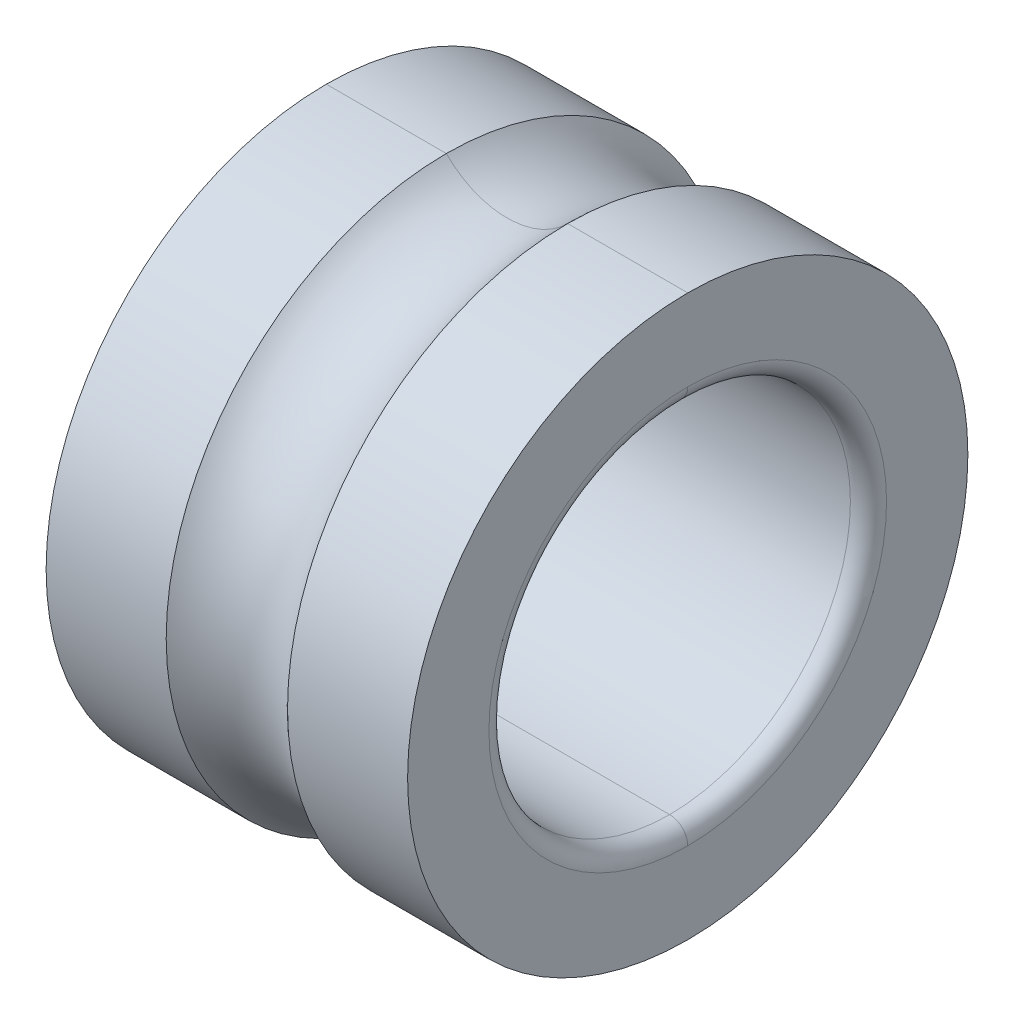
ISO-10303-21;
HEADER;
FILE_DESCRIPTION(('STEP AP214'),'2;1');
FILE_NAME('part.step','',(''),(''),'','','');
FILE_SCHEMA(('AUTOMOTIVE_DESIGN { 1 0 10303 214 1 1 1 1 }'));
ENDSEC;
DATA;
#1=APPLICATION_CONTEXT('core data for automotive mechanical design processes');
#2=APPLICATION_PROTOCOL_DEFINITION('international standard','automotive_design',2000,#1);
#3=PRODUCT_CONTEXT('',#1,'mechanical');
#4=PRODUCT('Part','Part','',(#3));
#5=PRODUCT_RELATED_PRODUCT_CATEGORY('part','',(#4));
#6=PRODUCT_DEFINITION_FORMATION('','',#4);
#7=PRODUCT_DEFINITION_CONTEXT('part definition',#1,'design');
#8=PRODUCT_DEFINITION('design','',#6,#7);
#9=PRODUCT_DEFINITION_SHAPE('','',#8);
#10=(LENGTH_UNIT() NAMED_UNIT(*) SI_UNIT(.MILLI.,.METRE.));
#11=(NAMED_UNIT(*) PLANE_ANGLE_UNIT() SI_UNIT($,.RADIAN.));
#12=(NAMED_UNIT(*) SI_UNIT($,.STERADIAN.) SOLID_ANGLE_UNIT());
#13=UNCERTAINTY_MEASURE_WITH_UNIT(LENGTH_MEASURE(1.E-05),#10,'distance_accuracy_value','');
#14=(GEOMETRIC_REPRESENTATION_CONTEXT(3) GLOBAL_UNCERTAINTY_ASSIGNED_CONTEXT((#13)) GLOBAL_UNIT_ASSIGNED_CONTEXT((#10,
#11,#12)) REPRESENTATION_CONTEXT('',''));
#15=CARTESIAN_POINT('',(0.,0.,0.));
#16=DIRECTION('',(0.,0.,1.));
#17=DIRECTION('',(1.,0.,0.));
#18=AXIS2_PLACEMENT_3D('',#15,#16,#17);
#19=CARTESIAN_POINT('',(-2.19329,0.,0.));
#20=DIRECTION('',(1.,0.,0.));
#21=DIRECTION('',(0.,-1.,0.));
#22=AXIS2_PLACEMENT_3D('',#19,#20,#21);
#23=CYLINDRICAL_SURFACE('',#22,1.9939);
#24=CARTESIAN_POINT('',(-1.79451,0.,0.));
#25=DIRECTION('',(-1.,0.,0.));
#26=DIRECTION('',(0.,1.,0.));
#27=AXIS2_PLACEMENT_3D('',#24,#25,#26);
#28=CIRCLE('',#27,1.9939);
#29=CARTESIAN_POINT('',(-1.79451,1.9939,0.));
#30=VERTEX_POINT('',#29);
#31=CARTESIAN_POINT('',(-1.79451,-1.9939,0.));
#32=VERTEX_POINT('',#31);
#33=EDGE_CURVE('E19',#30,#32,#28,.T.);
#34=ORIENTED_EDGE('',*,*,#33,.T.);
#35=DIRECTION('',(1.,0.,0.));
#36=VECTOR('',#35,1.);
#37=CARTESIAN_POINT('',(-1.79451,-1.9939,0.));
#38=LINE('',#37,#36);
#39=CARTESIAN_POINT('',(1.79451,-1.9939,0.));
#40=VERTEX_POINT('',#39);
#41=EDGE_CURVE('E10',#32,#40,#38,.T.);
#42=ORIENTED_EDGE('',*,*,#41,.T.);
#43=CARTESIAN_POINT('',(1.79451,0.,0.));
#44=DIRECTION('',(-1.,0.,0.));
#45=DIRECTION('',(0.,1.,0.));
#46=AXIS2_PLACEMENT_3D('',#43,#44,#45);
#47=CIRCLE('',#46,1.9939);
#48=CARTESIAN_POINT('',(1.79451,1.9939,0.));
#49=VERTEX_POINT('',#48);
#50=EDGE_CURVE('E84',#49,#40,#47,.T.);
#51=ORIENTED_EDGE('',*,*,#50,.F.);
#52=DIRECTION('',(1.,0.,0.));
#53=VECTOR('',#52,1.);
#54=CARTESIAN_POINT('',(-1.79451,1.9939,0.));
#55=LINE('',#54,#53);
#56=EDGE_CURVE('E24',#30,#49,#55,.T.);
#57=ORIENTED_EDGE('',*,*,#56,.F.);
#58=EDGE_LOOP('',(#34,#42,#51,#57));
#59=FACE_BOUND('',#58,.T.);
#60=ADVANCED_FACE('F16',(#59),#23,.F.);
#61=CARTESIAN_POINT('',(-2.19329,0.,0.));
#62=DIRECTION('',(1.,0.,0.));
#63=DIRECTION('',(0.,-1.,0.));
#64=AXIS2_PLACEMENT_3D('',#61,#62,#63);
#65=CYLINDRICAL_SURFACE('',#64,1.9939);
#66=CARTESIAN_POINT('',(1.79451,0.,0.));
#67=DIRECTION('',(1.,0.,0.));
#68=DIRECTION('',(0.,1.,0.));
#69=AXIS2_PLACEMENT_3D('',#66,#67,#68);
#70=CIRCLE('',#69,1.9939);
#71=EDGE_CURVE('E88',#49,#40,#70,.T.);
#72=ORIENTED_EDGE('',*,*,#71,.T.);
#73=ORIENTED_EDGE('',*,*,#41,.F.);
#74=CARTESIAN_POINT('',(-1.79451,0.,0.));
#75=DIRECTION('',(1.,0.,0.));
#76=DIRECTION('',(0.,1.,0.));
#77=AXIS2_PLACEMENT_3D('',#74,#75,#76);
#78=CIRCLE('',#77,1.9939);
#79=EDGE_CURVE('E91',#30,#32,#78,.T.);
#80=ORIENTED_EDGE('',*,*,#79,.F.);
#81=ORIENTED_EDGE('',*,*,#56,.T.);
#82=EDGE_LOOP('',(#72,#73,#80,#81));
#83=FACE_BOUND('',#82,.T.);
#84=ADVANCED_FACE('F93',(#83),#65,.F.);
#85=CARTESIAN_POINT('',(1.79451,0.,0.));
#86=DIRECTION('',(1.,0.,0.));
#87=DIRECTION('',(0.,-1.,0.));
#88=AXIS2_PLACEMENT_3D('',#85,#86,#87);
#89=TOROIDAL_SURFACE('',#88,2.19329,0.19939);
#90=CARTESIAN_POINT('',(1.9939,0.,0.));
#91=DIRECTION('',(1.,0.,0.));
#92=DIRECTION('',(0.,1.,0.));
#93=AXIS2_PLACEMENT_3D('',#90,#91,#92);
#94=CIRCLE('',#93,2.19329);
#95=CARTESIAN_POINT('',(1.9939,2.19329,0.));
#96=VERTEX_POINT('',#95);
#97=CARTESIAN_POINT('',(1.9939,-2.19329,0.));
#98=VERTEX_POINT('',#97);
#99=EDGE_CURVE('E147',#96,#98,#94,.T.);
#100=ORIENTED_EDGE('',*,*,#99,.T.);
#101=CARTESIAN_POINT('',(1.79451,-2.19329,0.));
#102=DIRECTION('',(0.,0.,-1.));
#103=DIRECTION('',(0.,1.,0.));
#104=AXIS2_PLACEMENT_3D('',#101,#102,#103);
#105=CIRCLE('',#104,0.19939);
#106=EDGE_CURVE('E151',#40,#98,#105,.T.);
#107=ORIENTED_EDGE('',*,*,#106,.F.);
#108=ORIENTED_EDGE('',*,*,#71,.F.);
#109=CARTESIAN_POINT('',(1.79451,2.19329,0.));
#110=DIRECTION('',(0.,0.,1.));
#111=DIRECTION('',(0.,-1.,0.));
#112=AXIS2_PLACEMENT_3D('',#109,#110,#111);
#113=CIRCLE('',#112,0.19939);
#114=EDGE_CURVE('E149',#49,#96,#113,.T.);
#115=ORIENTED_EDGE('',*,*,#114,.T.);
#116=EDGE_LOOP('',(#100,#107,#108,#115));
#117=FACE_BOUND('',#116,.T.);
#118=ADVANCED_FACE('F158',(#117),#89,.T.);
#119=CARTESIAN_POINT('',(1.79451,0.,0.));
#120=DIRECTION('',(1.,0.,0.));
#121=DIRECTION('',(0.,-1.,0.));
#122=AXIS2_PLACEMENT_3D('',#119,#120,#121);
#123=TOROIDAL_SURFACE('',#122,2.19329,0.19939);
#124=ORIENTED_EDGE('',*,*,#50,.T.);
#125=ORIENTED_EDGE('',*,*,#106,.T.);
#126=CARTESIAN_POINT('',(1.9939,0.,0.));
#127=DIRECTION('',(-1.,0.,0.));
#128=DIRECTION('',(0.,1.,0.));
#129=AXIS2_PLACEMENT_3D('',#126,#127,#128);
#130=CIRCLE('',#129,2.19329);
#131=EDGE_CURVE('E144',#96,#98,#130,.T.);
#132=ORIENTED_EDGE('',*,*,#131,.F.);
#133=ORIENTED_EDGE('',*,*,#114,.F.);
#134=EDGE_LOOP('',(#124,#125,#132,#133));
#135=FACE_BOUND('',#134,.T.);
#136=ADVANCED_FACE('F162',(#135),#123,.T.);
#137=CARTESIAN_POINT('',(1.9939,0.,0.));
#138=DIRECTION('',(1.,0.,0.));
#139=DIRECTION('',(0.,-1.,0.));
#140=AXIS2_PLACEMENT_3D('',#137,#138,#139);
#141=PLANE('',#140);
#142=ORIENTED_EDGE('',*,*,#99,.F.);
#143=ORIENTED_EDGE('',*,*,#131,.T.);
#144=EDGE_LOOP('',(#142,#143));
#145=FACE_BOUND('',#144,.T.);
#146=CARTESIAN_POINT('',(1.9939,0.,0.));
#147=DIRECTION('',(-1.,0.,0.));
#148=DIRECTION('',(0.,1.,0.));
#149=AXIS2_PLACEMENT_3D('',#146,#147,#148);
#150=CIRCLE('',#149,3.0905069);
#151=CARTESIAN_POINT('',(1.9939,3.0905069,0.));
#152=VERTEX_POINT('',#151);
#153=CARTESIAN_POINT('',(1.9939,-3.0905069,0.));
#154=VERTEX_POINT('',#153);
#155=EDGE_CURVE('E139',#152,#154,#150,.T.);
#156=ORIENTED_EDGE('',*,*,#155,.F.);
#157=CARTESIAN_POINT('',(1.9939,0.,0.));
#158=DIRECTION('',(1.,0.,0.));
#159=DIRECTION('',(0.,1.,0.));
#160=AXIS2_PLACEMENT_3D('',#157,#158,#159);
#161=CIRCLE('',#160,3.0905069);
#162=EDGE_CURVE('E142',#152,#154,#161,.T.);
#163=ORIENTED_EDGE('',*,*,#162,.T.);
#164=EDGE_LOOP('',(#156,#163));
#165=FACE_BOUND('',#164,.T.);
#166=ADVANCED_FACE('F164',(#145,#165),#141,.T.);
#167=CARTESIAN_POINT('',(-2.19329,0.,0.));
#168=DIRECTION('',(1.,0.,0.));
#169=DIRECTION('',(0.,-1.,0.));
#170=AXIS2_PLACEMENT_3D('',#167,#168,#169);
#171=CYLINDRICAL_SURFACE('',#170,3.0905069);
#172=CARTESIAN_POINT('',(0.669246824752564,0.,0.));
#173=DIRECTION('',(1.,0.,0.));
#174=DIRECTION('',(0.,1.,0.));
#175=AXIS2_PLACEMENT_3D('',#172,#173,#174);
#176=CIRCLE('',#175,3.0905069);
#177=CARTESIAN_POINT('',(0.669246824752564,3.0905069,0.));
#178=VERTEX_POINT('',#177);
#179=CARTESIAN_POINT('',(0.669246824752564,-3.0905069,0.));
#180=VERTEX_POINT('',#179);
#181=EDGE_CURVE('E125',#178,#180,#176,.T.);
#182=ORIENTED_EDGE('',*,*,#181,.T.);
#183=DIRECTION('',(-1.,0.,0.));
#184=VECTOR('',#183,1.);
#185=CARTESIAN_POINT('',(1.9939,-3.0905069,0.));
#186=LINE('',#185,#184);
#187=EDGE_CURVE('E136',#154,#180,#186,.T.);
#188=ORIENTED_EDGE('',*,*,#187,.F.);
#189=ORIENTED_EDGE('',*,*,#162,.F.);
#190=DIRECTION('',(-1.,0.,0.));
#191=VECTOR('',#190,1.);
#192=CARTESIAN_POINT('',(1.9939,3.0905069,0.));
#193=LINE('',#192,#191);
#194=EDGE_CURVE('E134',#152,#178,#193,.T.);
#195=ORIENTED_EDGE('',*,*,#194,.T.);
#196=EDGE_LOOP('',(#182,#188,#189,#195));
#197=FACE_BOUND('',#196,.T.);
#198=ADVANCED_FACE('F167',(#197),#171,.T.);
#199=CARTESIAN_POINT('',(-2.19329,0.,0.));
#200=DIRECTION('',(1.,0.,0.));
#201=DIRECTION('',(0.,-1.,0.));
#202=AXIS2_PLACEMENT_3D('',#199,#200,#201);
#203=CYLINDRICAL_SURFACE('',#202,3.0905069);
#204=ORIENTED_EDGE('',*,*,#155,.T.);
#205=ORIENTED_EDGE('',*,*,#187,.T.);
#206=CARTESIAN_POINT('',(0.669246824752564,0.,0.));
#207=DIRECTION('',(-1.,0.,0.));
#208=DIRECTION('',(0.,1.,0.));
#209=AXIS2_PLACEMENT_3D('',#206,#207,#208);
#210=CIRCLE('',#209,3.0905069);
#211=EDGE_CURVE('E131',#178,#180,#210,.T.);
#212=ORIENTED_EDGE('',*,*,#211,.F.);
#213=ORIENTED_EDGE('',*,*,#194,.F.);
#214=EDGE_LOOP('',(#204,#205,#212,#213));
#215=FACE_BOUND('',#214,.T.);
#216=ADVANCED_FACE('F175',(#215),#203,.T.);
#217=CARTESIAN_POINT('',(0.,0.,0.));
#218=DIRECTION('',(1.,0.,0.));
#219=DIRECTION('',(0.,-1.,0.));
#220=AXIS2_PLACEMENT_3D('',#217,#218,#219);
#221=TOROIDAL_SURFACE('',#220,3.7465,0.937133);
#222=ORIENTED_EDGE('',*,*,#211,.T.);
#223=CARTESIAN_POINT('',(0.,-3.7465,0.));
#224=DIRECTION('',(0.,0.,1.));
#225=DIRECTION('',(0.714142842854284,0.700000000000001,0.));
#226=AXIS2_PLACEMENT_3D('',#223,#224,#225);
#227=CIRCLE('',#226,0.937133);
#228=CARTESIAN_POINT('',(-0.669246824752564,-3.0905069,0.));
#229=VERTEX_POINT('',#228);
#230=EDGE_CURVE('E127',#180,#229,#227,.T.);
#231=ORIENTED_EDGE('',*,*,#230,.T.);
#232=CARTESIAN_POINT('',(-0.669246824752564,0.,0.));
#233=DIRECTION('',(-1.,0.,0.));
#234=DIRECTION('',(0.,1.,0.));
#235=AXIS2_PLACEMENT_3D('',#232,#233,#234);
#236=CIRCLE('',#235,3.0905069);
#237=CARTESIAN_POINT('',(-0.669246824752564,3.0905069,0.));
#238=VERTEX_POINT('',#237);
#239=EDGE_CURVE('E118',#238,#229,#236,.T.);
#240=ORIENTED_EDGE('',*,*,#239,.F.);
#241=CARTESIAN_POINT('',(0.,3.7465,0.));
#242=DIRECTION('',(0.,0.,-1.));
#243=DIRECTION('',(0.714142842854284,-0.700000000000001,0.));
#244=AXIS2_PLACEMENT_3D('',#241,#242,#243);
#245=CIRCLE('',#244,0.937133);
#246=EDGE_CURVE('E124',#178,#238,#245,.T.);
#247=ORIENTED_EDGE('',*,*,#246,.F.);
#248=EDGE_LOOP('',(#222,#231,#240,#247));
#249=FACE_BOUND('',#248,.T.);
#250=ADVANCED_FACE('F180',(#249),#221,.F.);
#251=CARTESIAN_POINT('',(0.,0.,0.));
#252=DIRECTION('',(1.,0.,0.));
#253=DIRECTION('',(0.,-1.,0.));
#254=AXIS2_PLACEMENT_3D('',#251,#252,#253);
#255=TOROIDAL_SURFACE('',#254,3.7465,0.937133);
#256=CARTESIAN_POINT('',(-0.669246824752564,0.,0.));
#257=DIRECTION('',(1.,0.,0.));
#258=DIRECTION('',(0.,1.,0.));
#259=AXIS2_PLACEMENT_3D('',#256,#257,#258);
#260=CIRCLE('',#259,3.0905069);
#261=EDGE_CURVE('E121',#238,#229,#260,.T.);
#262=ORIENTED_EDGE('',*,*,#261,.T.);
#263=ORIENTED_EDGE('',*,*,#230,.F.);
#264=ORIENTED_EDGE('',*,*,#181,.F.);
#265=ORIENTED_EDGE('',*,*,#246,.T.);
#266=EDGE_LOOP('',(#262,#263,#264,#265));
#267=FACE_BOUND('',#266,.T.);
#268=ADVANCED_FACE('F183',(#267),#255,.F.);
#269=CARTESIAN_POINT('',(-2.19329,0.,0.));
#270=DIRECTION('',(1.,0.,0.));
#271=DIRECTION('',(0.,-1.,0.));
#272=AXIS2_PLACEMENT_3D('',#269,#270,#271);
#273=CYLINDRICAL_SURFACE('',#272,3.0905069);
#274=CARTESIAN_POINT('',(-1.9939,0.,0.));
#275=DIRECTION('',(1.,0.,0.));
#276=DIRECTION('',(0.,1.,0.));
#277=AXIS2_PLACEMENT_3D('',#274,#275,#276);
#278=CIRCLE('',#277,3.0905069);
#279=CARTESIAN_POINT('',(-1.9939,3.0905069,0.));
#280=VERTEX_POINT('',#279);
#281=CARTESIAN_POINT('',(-1.9939,-3.0905069,0.));
#282=VERTEX_POINT('',#281);
#283=EDGE_CURVE('E38',#280,#282,#278,.T.);
#284=ORIENTED_EDGE('',*,*,#283,.T.);
#285=DIRECTION('',(-1.,0.,0.));
#286=VECTOR('',#285,1.);
#287=CARTESIAN_POINT('',(-0.669246824752564,-3.0905069,0.));
#288=LINE('',#287,#286);
#289=EDGE_CURVE('E116',#229,#282,#288,.T.);
#290=ORIENTED_EDGE('',*,*,#289,.F.);
#291=ORIENTED_EDGE('',*,*,#261,.F.);
#292=DIRECTION('',(-1.,0.,0.));
#293=VECTOR('',#292,1.);
#294=CARTESIAN_POINT('',(-0.669246824752564,3.0905069,0.));
#295=LINE('',#294,#293);
#296=EDGE_CURVE('E114',#238,#280,#295,.T.);
#297=ORIENTED_EDGE('',*,*,#296,.T.);
#298=EDGE_LOOP('',(#284,#290,#291,#297));
#299=FACE_BOUND('',#298,.T.);
#300=ADVANCED_FACE('F185',(#299),#273,.T.);
#301=CARTESIAN_POINT('',(-2.19329,0.,0.));
#302=DIRECTION('',(1.,0.,0.));
#303=DIRECTION('',(0.,-1.,0.));
#304=AXIS2_PLACEMENT_3D('',#301,#302,#303);
#305=CYLINDRICAL_SURFACE('',#304,3.0905069);
#306=ORIENTED_EDGE('',*,*,#239,.T.);
#307=ORIENTED_EDGE('',*,*,#289,.T.);
#308=CARTESIAN_POINT('',(-1.9939,0.,0.));
#309=DIRECTION('',(-1.,0.,0.));
#310=DIRECTION('',(0.,1.,0.));
#311=AXIS2_PLACEMENT_3D('',#308,#309,#310);
#312=CIRCLE('',#311,3.0905069);
#313=EDGE_CURVE('E96',#280,#282,#312,.T.);
#314=ORIENTED_EDGE('',*,*,#313,.F.);
#315=ORIENTED_EDGE('',*,*,#296,.F.);
#316=EDGE_LOOP('',(#306,#307,#314,#315));
#317=FACE_BOUND('',#316,.T.);
#318=ADVANCED_FACE('F188',(#317),#305,.T.);
#319=CARTESIAN_POINT('',(-1.9939,0.,0.));
#320=DIRECTION('',(1.,0.,0.));
#321=DIRECTION('',(0.,-1.,0.));
#322=AXIS2_PLACEMENT_3D('',#319,#320,#321);
#323=PLANE('',#322);
#324=CARTESIAN_POINT('',(-1.9939,0.,0.));
#325=DIRECTION('',(-1.,0.,0.));
#326=DIRECTION('',(0.,1.,0.));
#327=AXIS2_PLACEMENT_3D('',#324,#325,#326);
#328=CIRCLE('',#327,2.19329);
#329=CARTESIAN_POINT('',(-1.9939,2.19329,0.));
#330=VERTEX_POINT('',#329);
#331=CARTESIAN_POINT('',(-1.9939,-2.19329,0.));
#332=VERTEX_POINT('',#331);
#333=EDGE_CURVE('E106',#330,#332,#328,.T.);
#334=ORIENTED_EDGE('',*,*,#333,.F.);
#335=CARTESIAN_POINT('',(-1.9939,0.,0.));
#336=DIRECTION('',(1.,0.,0.));
#337=DIRECTION('',(0.,1.,0.));
#338=AXIS2_PLACEMENT_3D('',#335,#336,#337);
#339=CIRCLE('',#338,2.19329);
#340=EDGE_CURVE('E30',#330,#332,#339,.T.);
#341=ORIENTED_EDGE('',*,*,#340,.T.);
#342=EDGE_LOOP('',(#334,#341));
#343=FACE_BOUND('',#342,.T.);
#344=ORIENTED_EDGE('',*,*,#283,.F.);
#345=ORIENTED_EDGE('',*,*,#313,.T.);
#346=EDGE_LOOP('',(#344,#345));
#347=FACE_BOUND('',#346,.T.);
#348=ADVANCED_FACE('F190',(#343,#347),#323,.F.);
#349=CARTESIAN_POINT('',(-1.79451,0.,0.));
#350=DIRECTION('',(1.,0.,0.));
#351=DIRECTION('',(0.,-1.,0.));
#352=AXIS2_PLACEMENT_3D('',#349,#350,#351);
#353=TOROIDAL_SURFACE('',#352,2.19329,0.19939);
#354=ORIENTED_EDGE('',*,*,#79,.T.);
#355=CARTESIAN_POINT('',(-1.79451,-2.19329,0.));
#356=DIRECTION('',(0.,0.,-1.));
#357=DIRECTION('',(-1.,0.,0.));
#358=AXIS2_PLACEMENT_3D('',#355,#356,#357);
#359=CIRCLE('',#358,0.19939);
#360=EDGE_CURVE('E105',#332,#32,#359,.T.);
#361=ORIENTED_EDGE('',*,*,#360,.F.);
#362=ORIENTED_EDGE('',*,*,#340,.F.);
#363=CARTESIAN_POINT('',(-1.79451,2.19329,0.));
#364=DIRECTION('',(0.,0.,1.));
#365=DIRECTION('',(-1.,0.,0.));
#366=AXIS2_PLACEMENT_3D('',#363,#364,#365);
#367=CIRCLE('',#366,0.19939);
#368=EDGE_CURVE('E99',#330,#30,#367,.T.);
#369=ORIENTED_EDGE('',*,*,#368,.T.);
#370=EDGE_LOOP('',(#354,#361,#362,#369));
#371=FACE_BOUND('',#370,.T.);
#372=ADVANCED_FACE('F100',(#371),#353,.T.);
#373=CARTESIAN_POINT('',(-1.79451,0.,0.));
#374=DIRECTION('',(1.,0.,0.));
#375=DIRECTION('',(0.,-1.,0.));
#376=AXIS2_PLACEMENT_3D('',#373,#374,#375);
#377=TOROIDAL_SURFACE('',#376,2.19329,0.19939);
#378=ORIENTED_EDGE('',*,*,#333,.T.);
#379=ORIENTED_EDGE('',*,*,#360,.T.);
#380=ORIENTED_EDGE('',*,*,#33,.F.);
#381=ORIENTED_EDGE('',*,*,#368,.F.);
#382=EDGE_LOOP('',(#378,#379,#380,#381));
#383=FACE_BOUND('',#382,.T.);
#384=ADVANCED_FACE('F104',(#383),#377,.T.);
#385=CLOSED_SHELL('',(#60,#84,#118,#136,#166,#198,#216,#250,#268,#300,#318,#348,#372,#384));
#386=MANIFOLD_SOLID_BREP('B1',#385);
#387=ADVANCED_BREP_SHAPE_REPRESENTATION('',(#18,#386),#14);
#388=SHAPE_DEFINITION_REPRESENTATION(#9,#387);
ENDSEC;
END-ISO-10303-21;
